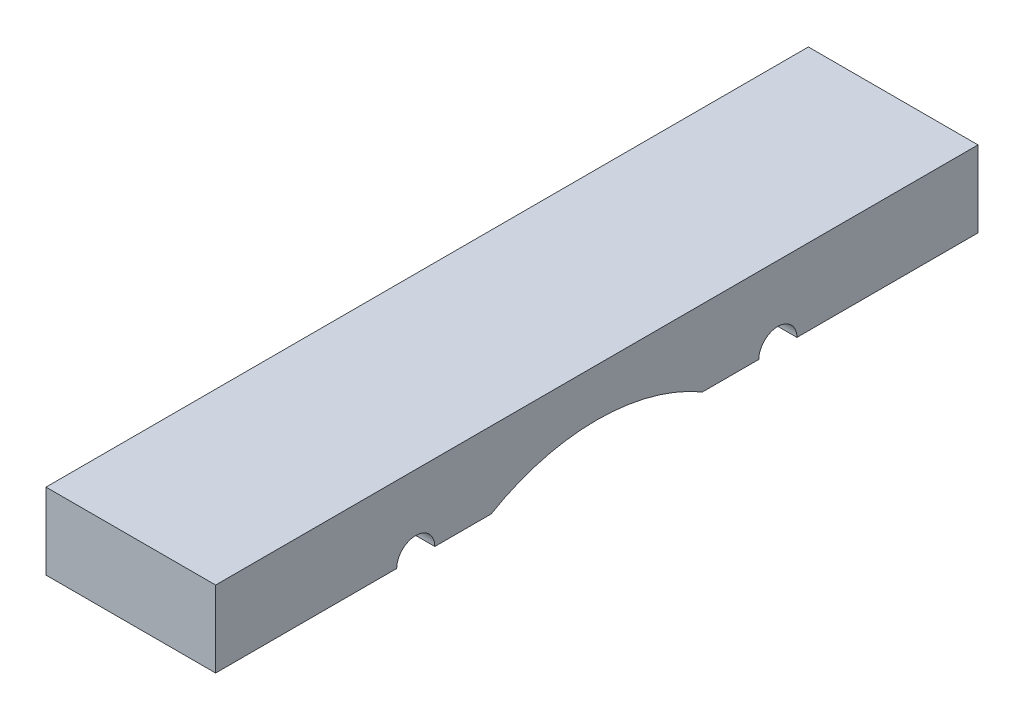
ISO-10303-21;
HEADER;
FILE_DESCRIPTION(('STEP AP214'),'2;1');
FILE_NAME('part.step','',(''),(''),'','','');
FILE_SCHEMA(('AUTOMOTIVE_DESIGN { 1 0 10303 214 1 1 1 1 }'));
ENDSEC;
DATA;
#1=APPLICATION_CONTEXT('core data for automotive mechanical design processes');
#2=APPLICATION_PROTOCOL_DEFINITION('international standard','automotive_design',2000,#1);
#3=PRODUCT_CONTEXT('',#1,'mechanical');
#4=PRODUCT('Part','Part','',(#3));
#5=PRODUCT_RELATED_PRODUCT_CATEGORY('part','',(#4));
#6=PRODUCT_DEFINITION_FORMATION('','',#4);
#7=PRODUCT_DEFINITION_CONTEXT('part definition',#1,'design');
#8=PRODUCT_DEFINITION('design','',#6,#7);
#9=PRODUCT_DEFINITION_SHAPE('','',#8);
#10=(LENGTH_UNIT() NAMED_UNIT(*) SI_UNIT(.MILLI.,.METRE.));
#11=(NAMED_UNIT(*) PLANE_ANGLE_UNIT() SI_UNIT($,.RADIAN.));
#12=(NAMED_UNIT(*) SI_UNIT($,.STERADIAN.) SOLID_ANGLE_UNIT());
#13=UNCERTAINTY_MEASURE_WITH_UNIT(LENGTH_MEASURE(1.E-05),#10,'distance_accuracy_value','');
#14=(GEOMETRIC_REPRESENTATION_CONTEXT(3) GLOBAL_UNCERTAINTY_ASSIGNED_CONTEXT((#13)) GLOBAL_UNIT_ASSIGNED_CONTEXT((#10,
#11,#12)) REPRESENTATION_CONTEXT('',''));
#15=CARTESIAN_POINT('',(0.,0.,0.));
#16=DIRECTION('',(0.,0.,1.));
#17=DIRECTION('',(1.,0.,0.));
#18=AXIS2_PLACEMENT_3D('',#15,#16,#17);
#19=CARTESIAN_POINT('',(4.45,23.3,-13.95));
#20=DIRECTION('',(0.,-1.,0.));
#21=DIRECTION('',(0.,0.,-1.));
#22=AXIS2_PLACEMENT_3D('',#19,#20,#21);
#23=PLANE('',#22);
#24=DIRECTION('',(1.,0.,0.));
#25=VECTOR('',#24,1.);
#26=CARTESIAN_POINT('',(-4.45,23.3,8.5));
#27=LINE('',#26,#25);
#28=CARTESIAN_POINT('',(-4.45,23.3,8.5));
#29=VERTEX_POINT('',#28);
#30=CARTESIAN_POINT('',(4.45,23.3,8.5));
#31=VERTEX_POINT('',#30);
#32=EDGE_CURVE('E11',#29,#31,#27,.T.);
#33=ORIENTED_EDGE('',*,*,#32,.F.);
#34=DIRECTION('',(0.,0.,1.));
#35=VECTOR('',#34,1.);
#36=CARTESIAN_POINT('',(-4.45,23.3,-13.95));
#37=LINE('',#36,#35);
#38=CARTESIAN_POINT('',(-4.45,23.3,5.54526825320471));
#39=VERTEX_POINT('',#38);
#40=EDGE_CURVE('E179',#39,#29,#37,.T.);
#41=ORIENTED_EDGE('',*,*,#40,.F.);
#42=DIRECTION('',(1.,0.,0.));
#43=VECTOR('',#42,1.);
#44=CARTESIAN_POINT('',(-4.45,23.3,5.54526825320471));
#45=LINE('',#44,#43);
#46=CARTESIAN_POINT('',(4.45,23.3,5.54526825320471));
#47=VERTEX_POINT('',#46);
#48=EDGE_CURVE('E160',#47,#39,#45,.F.);
#49=ORIENTED_EDGE('',*,*,#48,.F.);
#50=DIRECTION('',(0.,0.,1.));
#51=VECTOR('',#50,1.);
#52=CARTESIAN_POINT('',(4.45,23.3,-13.95));
#53=LINE('',#52,#51);
#54=EDGE_CURVE('E201',#47,#31,#53,.T.);
#55=ORIENTED_EDGE('',*,*,#54,.T.);
#56=EDGE_LOOP('',(#33,#41,#49,#55));
#57=FACE_BOUND('',#56,.T.);
#58=ADVANCED_FACE('F45',(#57),#23,.T.);
#59=DIRECTION('',(1.,0.,0.));
#60=VECTOR('',#59,1.);
#61=CARTESIAN_POINT('',(-4.45,23.3,-5.54526825320472));
#62=LINE('',#61,#60);
#63=CARTESIAN_POINT('',(-4.45,23.3,-5.54526825320472));
#64=VERTEX_POINT('',#63);
#65=CARTESIAN_POINT('',(4.45,23.3,-5.54526825320472));
#66=VERTEX_POINT('',#65);
#67=EDGE_CURVE('E163',#64,#66,#62,.T.);
#68=ORIENTED_EDGE('',*,*,#67,.F.);
#69=CARTESIAN_POINT('',(-4.45,23.3,-8.5));
#70=VERTEX_POINT('',#69);
#71=EDGE_CURVE('E192',#70,#64,#37,.T.);
#72=ORIENTED_EDGE('',*,*,#71,.F.);
#73=DIRECTION('',(1.,0.,0.));
#74=VECTOR('',#73,1.);
#75=CARTESIAN_POINT('',(-4.45,23.3,-8.5));
#76=LINE('',#75,#74);
#77=CARTESIAN_POINT('',(4.45,23.3,-8.5));
#78=VERTEX_POINT('',#77);
#79=EDGE_CURVE('E149',#78,#70,#76,.F.);
#80=ORIENTED_EDGE('',*,*,#79,.F.);
#81=EDGE_CURVE('E212',#78,#66,#53,.T.);
#82=ORIENTED_EDGE('',*,*,#81,.T.);
#83=EDGE_LOOP('',(#68,#72,#80,#82));
#84=FACE_BOUND('',#83,.T.);
#85=ADVANCED_FACE('F209',(#84),#23,.T.);
#86=DIRECTION('',(1.,0.,0.));
#87=VECTOR('',#86,1.);
#88=CARTESIAN_POINT('',(-4.45,23.3,-10.5));
#89=LINE('',#88,#87);
#90=CARTESIAN_POINT('',(-4.45,23.3,-10.5));
#91=VERTEX_POINT('',#90);
#92=CARTESIAN_POINT('',(4.45,23.3,-10.5));
#93=VERTEX_POINT('',#92);
#94=EDGE_CURVE('E157',#91,#93,#89,.T.);
#95=ORIENTED_EDGE('',*,*,#94,.F.);
#96=CARTESIAN_POINT('',(-4.45,23.3,-20.));
#97=VERTEX_POINT('',#96);
#98=EDGE_CURVE('E189',#97,#91,#37,.T.);
#99=ORIENTED_EDGE('',*,*,#98,.F.);
#100=DIRECTION('',(1.,0.,0.));
#101=VECTOR('',#100,1.);
#102=CARTESIAN_POINT('',(-4.45,23.3,-20.));
#103=LINE('',#102,#101);
#104=CARTESIAN_POINT('',(4.45,23.3,-20.));
#105=VERTEX_POINT('',#104);
#106=EDGE_CURVE('E128',#97,#105,#103,.T.);
#107=ORIENTED_EDGE('',*,*,#106,.T.);
#108=EDGE_CURVE('E202',#105,#93,#53,.T.);
#109=ORIENTED_EDGE('',*,*,#108,.T.);
#110=EDGE_LOOP('',(#95,#99,#107,#109));
#111=FACE_BOUND('',#110,.T.);
#112=ADVANCED_FACE('F249',(#111),#23,.T.);
#113=CARTESIAN_POINT('',(4.45,29.39,20.));
#114=DIRECTION('',(-1.,0.,0.));
#115=DIRECTION('',(0.,0.,1.));
#116=AXIS2_PLACEMENT_3D('',#113,#114,#115);
#117=PLANE('',#116);
#118=DIRECTION('',(0.,-1.,0.));
#119=VECTOR('',#118,1.);
#120=CARTESIAN_POINT('',(4.45,29.39,-20.));
#121=LINE('',#120,#119);
#122=CARTESIAN_POINT('',(4.45,27.3,-20.));
#123=VERTEX_POINT('',#122);
#124=EDGE_CURVE('E145',#123,#105,#121,.T.);
#125=ORIENTED_EDGE('',*,*,#124,.F.);
#126=DIRECTION('',(0.,0.,-1.));
#127=VECTOR('',#126,1.);
#128=CARTESIAN_POINT('',(4.45,27.3,20.));
#129=LINE('',#128,#127);
#130=CARTESIAN_POINT('',(4.45,27.3,20.));
#131=VERTEX_POINT('',#130);
#132=EDGE_CURVE('E123',#131,#123,#129,.T.);
#133=ORIENTED_EDGE('',*,*,#132,.F.);
#134=DIRECTION('',(0.,-1.,0.));
#135=VECTOR('',#134,1.);
#136=CARTESIAN_POINT('',(4.45,29.39,20.));
#137=LINE('',#136,#135);
#138=CARTESIAN_POINT('',(4.45,23.3,20.));
#139=VERTEX_POINT('',#138);
#140=EDGE_CURVE('E151',#131,#139,#137,.T.);
#141=ORIENTED_EDGE('',*,*,#140,.T.);
#142=CARTESIAN_POINT('',(4.45,23.3,10.5));
#143=VERTEX_POINT('',#142);
#144=EDGE_CURVE('E198',#143,#139,#53,.T.);
#145=ORIENTED_EDGE('',*,*,#144,.F.);
#146=CARTESIAN_POINT('',(4.45,23.3,9.5));
#147=DIRECTION('',(1.,0.,0.));
#148=DIRECTION('',(0.,0.,1.));
#149=AXIS2_PLACEMENT_3D('',#146,#147,#148);
#150=CIRCLE('',#149,1.);
#151=EDGE_CURVE('E68',#31,#143,#150,.T.);
#152=ORIENTED_EDGE('',*,*,#151,.F.);
#153=ORIENTED_EDGE('',*,*,#54,.F.);
#154=CARTESIAN_POINT('',(4.45,13.8,0.));
#155=DIRECTION('',(1.,0.,0.));
#156=DIRECTION('',(0.,0.,-1.));
#157=AXIS2_PLACEMENT_3D('',#154,#155,#156);
#158=CIRCLE('',#157,11.);
#159=EDGE_CURVE('E181',#66,#47,#158,.T.);
#160=ORIENTED_EDGE('',*,*,#159,.F.);
#161=ORIENTED_EDGE('',*,*,#81,.F.);
#162=CARTESIAN_POINT('',(4.45,23.3,-9.5));
#163=DIRECTION('',(1.,0.,0.));
#164=DIRECTION('',(0.,0.,-1.));
#165=AXIS2_PLACEMENT_3D('',#162,#163,#164);
#166=CIRCLE('',#165,1.);
#167=EDGE_CURVE('E194',#93,#78,#166,.T.);
#168=ORIENTED_EDGE('',*,*,#167,.F.);
#169=ORIENTED_EDGE('',*,*,#108,.F.);
#170=EDGE_LOOP('',(#125,#133,#141,#145,#152,#153,#160,#161,#168,#169));
#171=FACE_BOUND('',#170,.T.);
#172=ADVANCED_FACE('F47',(#171),#117,.F.);
#173=CARTESIAN_POINT('',(-4.45,29.39,-20.));
#174=DIRECTION('',(0.,0.,1.));
#175=DIRECTION('',(1.,0.,0.));
#176=AXIS2_PLACEMENT_3D('',#173,#174,#175);
#177=PLANE('',#176);
#178=DIRECTION('',(0.,-1.,0.));
#179=VECTOR('',#178,1.);
#180=CARTESIAN_POINT('',(-4.45,29.39,-20.));
#181=LINE('',#180,#179);
#182=CARTESIAN_POINT('',(-4.45,27.3,-20.));
#183=VERTEX_POINT('',#182);
#184=EDGE_CURVE('E135',#183,#97,#181,.T.);
#185=ORIENTED_EDGE('',*,*,#184,.F.);
#186=DIRECTION('',(1.,0.,0.));
#187=VECTOR('',#186,1.);
#188=CARTESIAN_POINT('',(-4.45,27.3,-20.));
#189=LINE('',#188,#187);
#190=EDGE_CURVE('E120',#183,#123,#189,.T.);
#191=ORIENTED_EDGE('',*,*,#190,.T.);
#192=ORIENTED_EDGE('',*,*,#124,.T.);
#193=ORIENTED_EDGE('',*,*,#106,.F.);
#194=EDGE_LOOP('',(#185,#191,#192,#193));
#195=FACE_BOUND('',#194,.T.);
#196=ADVANCED_FACE('F142',(#195),#177,.F.);
#197=CARTESIAN_POINT('',(-4.45,29.39,20.));
#198=DIRECTION('',(1.,0.,0.));
#199=DIRECTION('',(0.,0.,-1.));
#200=AXIS2_PLACEMENT_3D('',#197,#198,#199);
#201=PLANE('',#200);
#202=DIRECTION('',(0.,-1.,0.));
#203=VECTOR('',#202,1.);
#204=CARTESIAN_POINT('',(-4.45,29.39,20.));
#205=LINE('',#204,#203);
#206=CARTESIAN_POINT('',(-4.45,27.3,20.));
#207=VERTEX_POINT('',#206);
#208=CARTESIAN_POINT('',(-4.45,23.3,20.));
#209=VERTEX_POINT('',#208);
#210=EDGE_CURVE('E138',#207,#209,#205,.T.);
#211=ORIENTED_EDGE('',*,*,#210,.F.);
#212=DIRECTION('',(0.,0.,-1.));
#213=VECTOR('',#212,1.);
#214=CARTESIAN_POINT('',(-4.45,27.3,20.));
#215=LINE('',#214,#213);
#216=EDGE_CURVE('E61',#207,#183,#215,.T.);
#217=ORIENTED_EDGE('',*,*,#216,.T.);
#218=ORIENTED_EDGE('',*,*,#184,.T.);
#219=ORIENTED_EDGE('',*,*,#98,.T.);
#220=CARTESIAN_POINT('',(-4.45,23.3,-9.5));
#221=DIRECTION('',(1.,0.,0.));
#222=DIRECTION('',(0.,0.,-1.));
#223=AXIS2_PLACEMENT_3D('',#220,#221,#222);
#224=CIRCLE('',#223,1.);
#225=EDGE_CURVE('E187',#91,#70,#224,.T.);
#226=ORIENTED_EDGE('',*,*,#225,.T.);
#227=ORIENTED_EDGE('',*,*,#71,.T.);
#228=CARTESIAN_POINT('',(-4.45,13.8,0.));
#229=DIRECTION('',(1.,0.,0.));
#230=DIRECTION('',(0.,0.,-1.));
#231=AXIS2_PLACEMENT_3D('',#228,#229,#230);
#232=CIRCLE('',#231,11.);
#233=EDGE_CURVE('E205',#64,#39,#232,.T.);
#234=ORIENTED_EDGE('',*,*,#233,.T.);
#235=ORIENTED_EDGE('',*,*,#40,.T.);
#236=CARTESIAN_POINT('',(-4.45,23.3,9.5));
#237=DIRECTION('',(1.,0.,0.));
#238=DIRECTION('',(0.,0.,1.));
#239=AXIS2_PLACEMENT_3D('',#236,#237,#238);
#240=CIRCLE('',#239,1.);
#241=CARTESIAN_POINT('',(-4.45,23.3,10.5));
#242=VERTEX_POINT('',#241);
#243=EDGE_CURVE('E168',#29,#242,#240,.T.);
#244=ORIENTED_EDGE('',*,*,#243,.T.);
#245=EDGE_CURVE('E175',#242,#209,#37,.T.);
#246=ORIENTED_EDGE('',*,*,#245,.T.);
#247=EDGE_LOOP('',(#211,#217,#218,#219,#226,#227,#234,#235,#244,#246));
#248=FACE_BOUND('',#247,.T.);
#249=ADVANCED_FACE('F133',(#248),#201,.F.);
#250=CARTESIAN_POINT('',(-4.45,29.39,20.));
#251=DIRECTION('',(0.,0.,-1.));
#252=DIRECTION('',(-1.,0.,0.));
#253=AXIS2_PLACEMENT_3D('',#250,#251,#252);
#254=PLANE('',#253);
#255=ORIENTED_EDGE('',*,*,#140,.F.);
#256=DIRECTION('',(1.,0.,0.));
#257=VECTOR('',#256,1.);
#258=CARTESIAN_POINT('',(-4.45,27.3,20.));
#259=LINE('',#258,#257);
#260=EDGE_CURVE('E129',#207,#131,#259,.T.);
#261=ORIENTED_EDGE('',*,*,#260,.F.);
#262=ORIENTED_EDGE('',*,*,#210,.T.);
#263=DIRECTION('',(1.,0.,0.));
#264=VECTOR('',#263,1.);
#265=CARTESIAN_POINT('',(-4.45,23.3,20.));
#266=LINE('',#265,#264);
#267=EDGE_CURVE('E185',#209,#139,#266,.T.);
#268=ORIENTED_EDGE('',*,*,#267,.T.);
#269=EDGE_LOOP('',(#255,#261,#262,#268));
#270=FACE_BOUND('',#269,.T.);
#271=ADVANCED_FACE('F242',(#270),#254,.F.);
#272=DIRECTION('',(1.,0.,0.));
#273=VECTOR('',#272,1.);
#274=CARTESIAN_POINT('',(-4.45,23.3,10.5));
#275=LINE('',#274,#273);
#276=EDGE_CURVE('E54',#143,#242,#275,.F.);
#277=ORIENTED_EDGE('',*,*,#276,.F.);
#278=ORIENTED_EDGE('',*,*,#144,.T.);
#279=ORIENTED_EDGE('',*,*,#267,.F.);
#280=ORIENTED_EDGE('',*,*,#245,.F.);
#281=EDGE_LOOP('',(#277,#278,#279,#280));
#282=FACE_BOUND('',#281,.T.);
#283=ADVANCED_FACE('F183',(#282),#23,.T.);
#284=CARTESIAN_POINT('',(-4.45,23.3,-9.5));
#285=DIRECTION('',(1.,0.,0.));
#286=DIRECTION('',(0.,0.,-1.));
#287=AXIS2_PLACEMENT_3D('',#284,#285,#286);
#288=CYLINDRICAL_SURFACE('',#287,1.);
#289=ORIENTED_EDGE('',*,*,#94,.T.);
#290=ORIENTED_EDGE('',*,*,#167,.T.);
#291=ORIENTED_EDGE('',*,*,#79,.T.);
#292=ORIENTED_EDGE('',*,*,#225,.F.);
#293=EDGE_LOOP('',(#289,#290,#291,#292));
#294=FACE_BOUND('',#293,.T.);
#295=ADVANCED_FACE('F251',(#294),#288,.F.);
#296=CARTESIAN_POINT('',(-4.45,13.8,0.));
#297=DIRECTION('',(1.,0.,0.));
#298=DIRECTION('',(0.,0.,-1.));
#299=AXIS2_PLACEMENT_3D('',#296,#297,#298);
#300=CYLINDRICAL_SURFACE('',#299,11.);
#301=ORIENTED_EDGE('',*,*,#67,.T.);
#302=ORIENTED_EDGE('',*,*,#159,.T.);
#303=ORIENTED_EDGE('',*,*,#48,.T.);
#304=ORIENTED_EDGE('',*,*,#233,.F.);
#305=EDGE_LOOP('',(#301,#302,#303,#304));
#306=FACE_BOUND('',#305,.T.);
#307=ADVANCED_FACE('F215',(#306),#300,.F.);
#308=CARTESIAN_POINT('',(-4.45,23.3,9.5));
#309=DIRECTION('',(1.,0.,0.));
#310=DIRECTION('',(0.,0.,-1.));
#311=AXIS2_PLACEMENT_3D('',#308,#309,#310);
#312=CYLINDRICAL_SURFACE('',#311,1.);
#313=ORIENTED_EDGE('',*,*,#32,.T.);
#314=ORIENTED_EDGE('',*,*,#151,.T.);
#315=ORIENTED_EDGE('',*,*,#276,.T.);
#316=ORIENTED_EDGE('',*,*,#243,.F.);
#317=EDGE_LOOP('',(#313,#314,#315,#316));
#318=FACE_BOUND('',#317,.T.);
#319=ADVANCED_FACE('F167',(#318),#312,.F.);
#320=CARTESIAN_POINT('',(-4.45,27.3,20.));
#321=DIRECTION('',(0.,-1.,0.));
#322=DIRECTION('',(0.,0.,-1.));
#323=AXIS2_PLACEMENT_3D('',#320,#321,#322);
#324=PLANE('',#323);
#325=ORIENTED_EDGE('',*,*,#132,.T.);
#326=ORIENTED_EDGE('',*,*,#190,.F.);
#327=ORIENTED_EDGE('',*,*,#216,.F.);
#328=ORIENTED_EDGE('',*,*,#260,.T.);
#329=EDGE_LOOP('',(#325,#326,#327,#328));
#330=FACE_BOUND('',#329,.T.);
#331=ADVANCED_FACE('F121',(#330),#324,.F.);
#332=CLOSED_SHELL('',(#58,#85,#112,#172,#196,#249,#271,#283,#295,#307,#319,#331));
#333=MANIFOLD_SOLID_BREP('B2',#332);
#334=ADVANCED_BREP_SHAPE_REPRESENTATION('',(#18,#333),#14);
#335=SHAPE_DEFINITION_REPRESENTATION(#9,#334);
ENDSEC;
END-ISO-10303-21;
